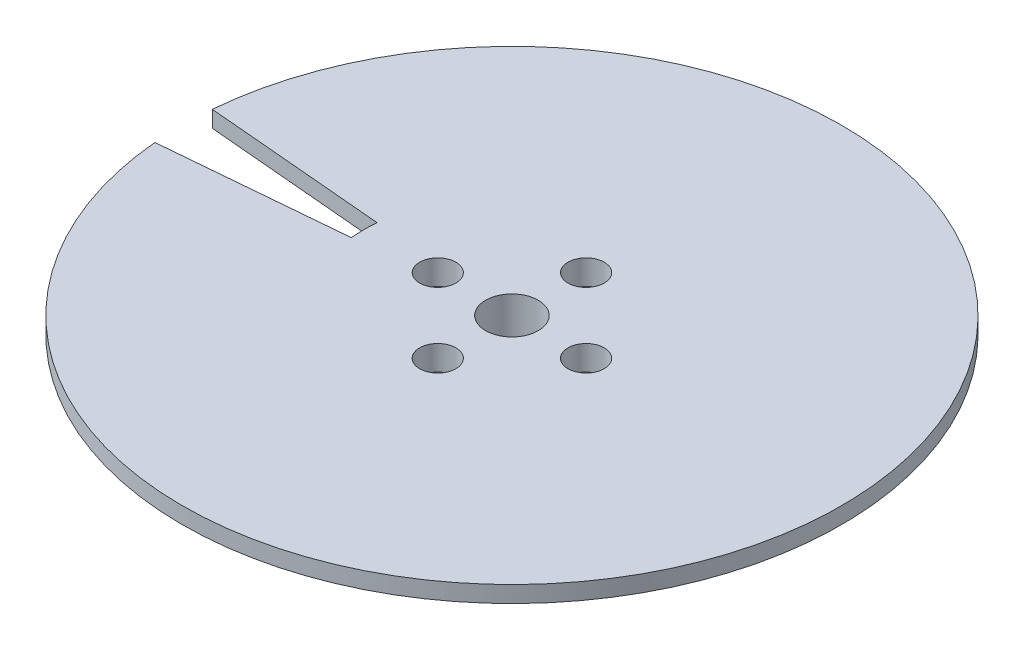
ISO-10303-21;
HEADER;
FILE_DESCRIPTION(('STEP AP214'),'2;1');
FILE_NAME('part.step','',(''),(''),'','','');
FILE_SCHEMA(('AUTOMOTIVE_DESIGN { 1 0 10303 214 1 1 1 1 }'));
ENDSEC;
DATA;
#1=APPLICATION_CONTEXT('core data for automotive mechanical design processes');
#2=APPLICATION_PROTOCOL_DEFINITION('international standard','automotive_design',2000,#1);
#3=PRODUCT_CONTEXT('',#1,'mechanical');
#4=PRODUCT('Part','Part','',(#3));
#5=PRODUCT_RELATED_PRODUCT_CATEGORY('part','',(#4));
#6=PRODUCT_DEFINITION_FORMATION('','',#4);
#7=PRODUCT_DEFINITION_CONTEXT('part definition',#1,'design');
#8=PRODUCT_DEFINITION('design','',#6,#7);
#9=PRODUCT_DEFINITION_SHAPE('','',#8);
#10=(LENGTH_UNIT() NAMED_UNIT(*) SI_UNIT(.MILLI.,.METRE.));
#11=(NAMED_UNIT(*) PLANE_ANGLE_UNIT() SI_UNIT($,.RADIAN.));
#12=(NAMED_UNIT(*) SI_UNIT($,.STERADIAN.) SOLID_ANGLE_UNIT());
#13=UNCERTAINTY_MEASURE_WITH_UNIT(LENGTH_MEASURE(1.E-05),#10,'distance_accuracy_value','');
#14=(GEOMETRIC_REPRESENTATION_CONTEXT(3) GLOBAL_UNCERTAINTY_ASSIGNED_CONTEXT((#13)) GLOBAL_UNIT_ASSIGNED_CONTEXT((#10,
#11,#12)) REPRESENTATION_CONTEXT('',''));
#15=CARTESIAN_POINT('',(0.,0.,0.));
#16=DIRECTION('',(0.,0.,1.));
#17=DIRECTION('',(1.,0.,0.));
#18=AXIS2_PLACEMENT_3D('',#15,#16,#17);
#19=CARTESIAN_POINT('',(0.,6.,0.));
#20=DIRECTION('',(0.,-1.,0.));
#21=DIRECTION('',(0.,0.,-1.));
#22=AXIS2_PLACEMENT_3D('',#19,#20,#21);
#23=CYLINDRICAL_SURFACE('',#22,7.5);
#24=DIRECTION('',(0.,-1.,0.));
#25=VECTOR('',#24,1.);
#26=CARTESIAN_POINT('',(0.85655319119696,3.,7.4509272329456));
#27=LINE('',#26,#25);
#28=CARTESIAN_POINT('',(0.856553191196959,3.,7.45092723294559));
#29=VERTEX_POINT('',#28);
#30=CARTESIAN_POINT('',(0.856553191196959,0.,7.45092723294559));
#31=VERTEX_POINT('',#30);
#32=EDGE_CURVE('E206',#29,#31,#27,.T.);
#33=ORIENTED_EDGE('',*,*,#32,.F.);
#34=CARTESIAN_POINT('',(0.,3.,0.));
#35=DIRECTION('',(0.,1.,0.));
#36=DIRECTION('',(0.,0.,1.));
#37=AXIS2_PLACEMENT_3D('',#34,#35,#36);
#38=CIRCLE('',#37,7.5);
#39=CARTESIAN_POINT('',(7.44042990767575,3.,0.943399591352612));
#40=VERTEX_POINT('',#39);
#41=EDGE_CURVE('E187',#29,#40,#38,.T.);
#42=ORIENTED_EDGE('',*,*,#41,.T.);
#43=DIRECTION('',(0.,-1.,0.));
#44=VECTOR('',#43,1.);
#45=CARTESIAN_POINT('',(7.44042990767575,3.,0.943399591352612));
#46=LINE('',#45,#44);
#47=CARTESIAN_POINT('',(7.44042990767575,0.,0.943399591352612));
#48=VERTEX_POINT('',#47);
#49=EDGE_CURVE('E401',#40,#48,#46,.T.);
#50=ORIENTED_EDGE('',*,*,#49,.T.);
#51=CARTESIAN_POINT('',(0.,0.,0.));
#52=DIRECTION('',(0.,1.,0.));
#53=DIRECTION('',(0.,0.,1.));
#54=AXIS2_PLACEMENT_3D('',#51,#52,#53);
#55=CIRCLE('',#54,7.5);
#56=EDGE_CURVE('E216',#31,#48,#55,.T.);
#57=ORIENTED_EDGE('',*,*,#56,.F.);
#58=EDGE_LOOP('',(#33,#42,#50,#57));
#59=FACE_BOUND('',#58,.T.);
#60=ADVANCED_FACE('F49',(#59),#23,.F.);
#61=DIRECTION('',(0.,-1.,0.));
#62=VECTOR('',#61,1.);
#63=CARTESIAN_POINT('',(7.45092723294559,3.,-0.856553191196986));
#64=LINE('',#63,#62);
#65=CARTESIAN_POINT('',(7.45092723294559,3.,-0.856553191196986));
#66=VERTEX_POINT('',#65);
#67=CARTESIAN_POINT('',(7.45092723294559,0.,-0.856553191196986));
#68=VERTEX_POINT('',#67);
#69=EDGE_CURVE('E396',#66,#68,#64,.T.);
#70=ORIENTED_EDGE('',*,*,#69,.F.);
#71=CARTESIAN_POINT('',(0.943399591352586,3.,-7.44042990767575));
#72=VERTEX_POINT('',#71);
#73=EDGE_CURVE('E200',#66,#72,#38,.T.);
#74=ORIENTED_EDGE('',*,*,#73,.T.);
#75=DIRECTION('',(0.,-1.,0.));
#76=VECTOR('',#75,1.);
#77=CARTESIAN_POINT('',(0.943399591352589,3.,-7.44042990767575));
#78=LINE('',#77,#76);
#79=CARTESIAN_POINT('',(0.943399591352589,0.,-7.44042990767575));
#80=VERTEX_POINT('',#79);
#81=EDGE_CURVE('E366',#72,#80,#78,.T.);
#82=ORIENTED_EDGE('',*,*,#81,.T.);
#83=EDGE_CURVE('E275',#68,#80,#55,.T.);
#84=ORIENTED_EDGE('',*,*,#83,.F.);
#85=EDGE_LOOP('',(#70,#74,#82,#84));
#86=FACE_BOUND('',#85,.T.);
#87=ADVANCED_FACE('F300',(#86),#23,.F.);
#88=DIRECTION('',(0.,-1.,0.));
#89=VECTOR('',#88,1.);
#90=CARTESIAN_POINT('',(-0.856553191197012,3.,-7.45092723294559));
#91=LINE('',#90,#89);
#92=CARTESIAN_POINT('',(-0.856553191197011,3.,-7.45092723294559));
#93=VERTEX_POINT('',#92);
#94=CARTESIAN_POINT('',(-0.856553191197012,0.,-7.45092723294559));
#95=VERTEX_POINT('',#94);
#96=EDGE_CURVE('E362',#93,#95,#91,.T.);
#97=ORIENTED_EDGE('',*,*,#96,.F.);
#98=CARTESIAN_POINT('',(-7.44042990767575,3.,-0.943399591352559));
#99=VERTEX_POINT('',#98);
#100=EDGE_CURVE('E453',#93,#99,#38,.T.);
#101=ORIENTED_EDGE('',*,*,#100,.T.);
#102=DIRECTION('',(0.,-1.,0.));
#103=VECTOR('',#102,1.);
#104=CARTESIAN_POINT('',(-7.44042990767576,3.,-0.943399591352555));
#105=LINE('',#104,#103);
#106=CARTESIAN_POINT('',(-7.44042990767576,0.,-0.943399591352555));
#107=VERTEX_POINT('',#106);
#108=EDGE_CURVE('E327',#99,#107,#105,.T.);
#109=ORIENTED_EDGE('',*,*,#108,.T.);
#110=EDGE_CURVE('E466',#95,#107,#55,.T.);
#111=ORIENTED_EDGE('',*,*,#110,.F.);
#112=EDGE_LOOP('',(#97,#101,#109,#111));
#113=FACE_BOUND('',#112,.T.);
#114=ADVANCED_FACE('F305',(#113),#23,.F.);
#115=DIRECTION('',(0.,-1.,0.));
#116=VECTOR('',#115,1.);
#117=CARTESIAN_POINT('',(-7.45092723294559,3.,0.856553191197039));
#118=LINE('',#117,#116);
#119=CARTESIAN_POINT('',(-7.45092723294559,3.,0.856553191197039));
#120=VERTEX_POINT('',#119);
#121=CARTESIAN_POINT('',(-7.45092723294559,0.,0.856553191197038));
#122=VERTEX_POINT('',#121);
#123=EDGE_CURVE('E321',#120,#122,#118,.T.);
#124=ORIENTED_EDGE('',*,*,#123,.F.);
#125=CARTESIAN_POINT('',(-0.943399591352638,3.,7.44042990767574));
#126=VERTEX_POINT('',#125);
#127=EDGE_CURVE('E202',#120,#126,#38,.T.);
#128=ORIENTED_EDGE('',*,*,#127,.T.);
#129=DIRECTION('',(0.,-1.,0.));
#130=VECTOR('',#129,1.);
#131=CARTESIAN_POINT('',(-0.943399591352635,3.,7.44042990767575));
#132=LINE('',#131,#130);
#133=CARTESIAN_POINT('',(-0.943399591352635,0.,7.44042990767575));
#134=VERTEX_POINT('',#133);
#135=EDGE_CURVE('E218',#126,#134,#132,.T.);
#136=ORIENTED_EDGE('',*,*,#135,.T.);
#137=EDGE_CURVE('E262',#122,#134,#55,.T.);
#138=ORIENTED_EDGE('',*,*,#137,.F.);
#139=EDGE_LOOP('',(#124,#128,#136,#138));
#140=FACE_BOUND('',#139,.T.);
#141=ADVANCED_FACE('F302',(#140),#23,.F.);
#142=CARTESIAN_POINT('',(0.,6.,0.));
#143=DIRECTION('',(0.,1.,0.));
#144=DIRECTION('',(0.,0.,1.));
#145=AXIS2_PLACEMENT_3D('',#142,#143,#144);
#146=PLANE('',#145);
#147=CARTESIAN_POINT('',(0.,6.,-4.5));
#148=DIRECTION('',(0.,1.,0.));
#149=DIRECTION('',(0.,0.,1.));
#150=AXIS2_PLACEMENT_3D('',#147,#148,#149);
#151=CIRCLE('',#150,1.1);
#152=CARTESIAN_POINT('',(0.,6.,-3.4));
#153=VERTEX_POINT('',#152);
#154=EDGE_CURVE('E505',#153,#153,#151,.T.);
#155=ORIENTED_EDGE('',*,*,#154,.F.);
#156=EDGE_LOOP('',(#155));
#157=FACE_BOUND('',#156,.T.);
#158=CARTESIAN_POINT('',(4.5,6.,0.));
#159=DIRECTION('',(0.,1.,0.));
#160=DIRECTION('',(0.,0.,1.));
#161=AXIS2_PLACEMENT_3D('',#158,#159,#160);
#162=CIRCLE('',#161,1.1);
#163=CARTESIAN_POINT('',(4.5,6.,1.1));
#164=VERTEX_POINT('',#163);
#165=EDGE_CURVE('E472',#164,#164,#162,.T.);
#166=ORIENTED_EDGE('',*,*,#165,.F.);
#167=EDGE_LOOP('',(#166));
#168=FACE_BOUND('',#167,.T.);
#169=CARTESIAN_POINT('',(0.,6.,4.5));
#170=DIRECTION('',(0.,1.,0.));
#171=DIRECTION('',(0.,0.,1.));
#172=AXIS2_PLACEMENT_3D('',#169,#170,#171);
#173=CIRCLE('',#172,1.1);
#174=CARTESIAN_POINT('',(0.,6.,5.6));
#175=VERTEX_POINT('',#174);
#176=EDGE_CURVE('E496',#175,#175,#173,.T.);
#177=ORIENTED_EDGE('',*,*,#176,.F.);
#178=EDGE_LOOP('',(#177));
#179=FACE_BOUND('',#178,.T.);
#180=CARTESIAN_POINT('',(-4.5,6.,0.));
#181=DIRECTION('',(0.,1.,0.));
#182=DIRECTION('',(0.,0.,1.));
#183=AXIS2_PLACEMENT_3D('',#180,#181,#182);
#184=CIRCLE('',#183,1.1);
#185=CARTESIAN_POINT('',(-4.5,6.,1.1));
#186=VERTEX_POINT('',#185);
#187=EDGE_CURVE('E474',#186,#186,#184,.T.);
#188=ORIENTED_EDGE('',*,*,#187,.F.);
#189=EDGE_LOOP('',(#188));
#190=FACE_BOUND('',#189,.T.);
#191=CARTESIAN_POINT('',(0.,6.,0.));
#192=DIRECTION('',(0.,1.,0.));
#193=DIRECTION('',(0.,0.,1.));
#194=AXIS2_PLACEMENT_3D('',#191,#192,#193);
#195=CIRCLE('',#194,1.6);
#196=CARTESIAN_POINT('',(0.,6.,1.6));
#197=VERTEX_POINT('',#196);
#198=EDGE_CURVE('E483',#197,#197,#195,.T.);
#199=ORIENTED_EDGE('',*,*,#198,.F.);
#200=EDGE_LOOP('',(#199));
#201=FACE_BOUND('',#200,.T.);
#202=CARTESIAN_POINT('',(0.,6.,0.));
#203=DIRECTION('',(0.,1.,0.));
#204=DIRECTION('',(0.,0.,1.));
#205=AXIS2_PLACEMENT_3D('',#202,#203,#204);
#206=CIRCLE('',#205,9.);
#207=CARTESIAN_POINT('',(-8.96575228282571,6.,-0.784401684728925));
#208=VERTEX_POINT('',#207);
#209=CARTESIAN_POINT('',(-8.96575228282571,6.,0.784401684728926));
#210=VERTEX_POINT('',#209);
#211=EDGE_CURVE('E274',#208,#210,#206,.T.);
#212=ORIENTED_EDGE('',*,*,#211,.T.);
#213=DIRECTION('',(-0.996194698091746,0.,0.0871557427476585));
#214=VECTOR('',#213,1.);
#215=CARTESIAN_POINT('',(0.,6.,0.));
#216=LINE('',#215,#214);
#217=CARTESIAN_POINT('',(-19.9238939618349,6.,1.74311485495317));
#218=VERTEX_POINT('',#217);
#219=EDGE_CURVE('E247',#210,#218,#216,.T.);
#220=ORIENTED_EDGE('',*,*,#219,.T.);
#221=CARTESIAN_POINT('',(0.,6.,0.));
#222=DIRECTION('',(0.,1.,0.));
#223=DIRECTION('',(0.,0.,1.));
#224=AXIS2_PLACEMENT_3D('',#221,#222,#223);
#225=CIRCLE('',#224,20.);
#226=CARTESIAN_POINT('',(-19.9238939618349,6.,-1.74311485495317));
#227=VERTEX_POINT('',#226);
#228=EDGE_CURVE('E251',#218,#227,#225,.T.);
#229=ORIENTED_EDGE('',*,*,#228,.T.);
#230=DIRECTION('',(-0.996194698091746,0.,-0.0871557427476583));
#231=VECTOR('',#230,1.);
#232=CARTESIAN_POINT('',(0.,6.,0.));
#233=LINE('',#232,#231);
#234=EDGE_CURVE('E236',#208,#227,#233,.T.);
#235=ORIENTED_EDGE('',*,*,#234,.F.);
#236=EDGE_LOOP('',(#212,#220,#229,#235));
#237=FACE_BOUND('',#236,.T.);
#238=ADVANCED_FACE('F310',(#157,#168,#179,#190,#201,#237),#146,.T.);
#239=CARTESIAN_POINT('',(0.,0.,0.));
#240=DIRECTION('',(0.,1.,0.));
#241=DIRECTION('',(0.,0.,1.));
#242=AXIS2_PLACEMENT_3D('',#239,#240,#241);
#243=PLANE('',#242);
#244=CARTESIAN_POINT('',(0.,0.,0.));
#245=DIRECTION('',(0.,1.,0.));
#246=DIRECTION('',(0.,0.,1.));
#247=AXIS2_PLACEMENT_3D('',#244,#245,#246);
#248=CIRCLE('',#247,7.99999999999999);
#249=CARTESIAN_POINT('',(0.,0.,7.99999999999999));
#250=VERTEX_POINT('',#249);
#251=EDGE_CURVE('E11',#250,#250,#248,.F.);
#252=ORIENTED_EDGE('',*,*,#251,.T.);
#253=EDGE_LOOP('',(#252));
#254=FACE_BOUND('',#253,.T.);
#255=ORIENTED_EDGE('',*,*,#56,.T.);
#256=DIRECTION('',(-1.,0.,0.));
#257=VECTOR('',#256,1.);
#258=CARTESIAN_POINT('',(6.3123397412791,0.,0.943399591352637));
#259=LINE('',#258,#257);
#260=CARTESIAN_POINT('',(5.41848661630125,0.,0.943399591352619));
#261=VERTEX_POINT('',#260);
#262=EDGE_CURVE('E413',#48,#261,#259,.T.);
#263=ORIENTED_EDGE('',*,*,#262,.T.);
#264=CARTESIAN_POINT('',(0.,0.,0.));
#265=DIRECTION('',(0.,1.,0.));
#266=DIRECTION('',(0.,0.,-1.));
#267=AXIS2_PLACEMENT_3D('',#264,#265,#266);
#268=CIRCLE('',#267,5.5);
#269=CARTESIAN_POINT('',(5.43289210555946,0.,-0.856553191196978));
#270=VERTEX_POINT('',#269);
#271=EDGE_CURVE('E410',#261,#270,#268,.T.);
#272=ORIENTED_EDGE('',*,*,#271,.T.);
#273=DIRECTION('',(1.,0.,0.));
#274=VECTOR('',#273,1.);
#275=CARTESIAN_POINT('',(6.32608265113426,0.,-0.856553191196982));
#276=LINE('',#275,#274);
#277=EDGE_CURVE('E418',#270,#68,#276,.T.);
#278=ORIENTED_EDGE('',*,*,#277,.T.);
#279=ORIENTED_EDGE('',*,*,#83,.T.);
#280=DIRECTION('',(0.,0.,1.));
#281=VECTOR('',#280,1.);
#282=CARTESIAN_POINT('',(0.943399591352638,0.,-6.3123397412791));
#283=LINE('',#282,#281);
#284=CARTESIAN_POINT('',(0.9433995913526,0.,-5.41848661630125));
#285=VERTEX_POINT('',#284);
#286=EDGE_CURVE('E379',#80,#285,#283,.T.);
#287=ORIENTED_EDGE('',*,*,#286,.T.);
#288=CARTESIAN_POINT('',(0.,0.,0.));
#289=DIRECTION('',(0.,1.,0.));
#290=DIRECTION('',(0.,0.,-1.));
#291=AXIS2_PLACEMENT_3D('',#288,#289,#290);
#292=CIRCLE('',#291,5.5);
#293=CARTESIAN_POINT('',(-0.856553191196997,0.,-5.43289210555945));
#294=VERTEX_POINT('',#293);
#295=EDGE_CURVE('E376',#285,#294,#292,.T.);
#296=ORIENTED_EDGE('',*,*,#295,.T.);
#297=DIRECTION('',(0.,0.,-1.));
#298=VECTOR('',#297,1.);
#299=CARTESIAN_POINT('',(-0.856553191197004,0.,-6.32608265113425));
#300=LINE('',#299,#298);
#301=EDGE_CURVE('E73',#294,#95,#300,.T.);
#302=ORIENTED_EDGE('',*,*,#301,.T.);
#303=ORIENTED_EDGE('',*,*,#110,.T.);
#304=DIRECTION('',(1.,0.,0.));
#305=VECTOR('',#304,1.);
#306=CARTESIAN_POINT('',(-6.3123397412791,0.,-0.943399591352638));
#307=LINE('',#306,#305);
#308=CARTESIAN_POINT('',(-5.41848661630125,0.,-0.943399591352581));
#309=VERTEX_POINT('',#308);
#310=EDGE_CURVE('E349',#107,#309,#307,.T.);
#311=ORIENTED_EDGE('',*,*,#310,.T.);
#312=CARTESIAN_POINT('',(0.,0.,0.));
#313=DIRECTION('',(0.,1.,0.));
#314=DIRECTION('',(0.,0.,-1.));
#315=AXIS2_PLACEMENT_3D('',#312,#313,#314);
#316=CIRCLE('',#315,5.5);
#317=CARTESIAN_POINT('',(-5.43289210555945,0.,0.856553191197016));
#318=VERTEX_POINT('',#317);
#319=EDGE_CURVE('E346',#309,#318,#316,.T.);
#320=ORIENTED_EDGE('',*,*,#319,.T.);
#321=DIRECTION('',(-1.,0.,0.));
#322=VECTOR('',#321,1.);
#323=CARTESIAN_POINT('',(-6.32608265113425,0.,0.856553191197027));
#324=LINE('',#323,#322);
#325=EDGE_CURVE('E66',#318,#122,#324,.T.);
#326=ORIENTED_EDGE('',*,*,#325,.T.);
#327=ORIENTED_EDGE('',*,*,#137,.T.);
#328=DIRECTION('',(0.,0.,-1.));
#329=VECTOR('',#328,1.);
#330=CARTESIAN_POINT('',(-0.943399591352637,0.,6.3123397412791));
#331=LINE('',#330,#329);
#332=CARTESIAN_POINT('',(-0.943399591352638,0.,5.41848661630124));
#333=VERTEX_POINT('',#332);
#334=EDGE_CURVE('E435',#134,#333,#331,.T.);
#335=ORIENTED_EDGE('',*,*,#334,.T.);
#336=CARTESIAN_POINT('',(0.,0.,0.));
#337=DIRECTION('',(0.,1.,0.));
#338=DIRECTION('',(0.,0.,-1.));
#339=AXIS2_PLACEMENT_3D('',#336,#337,#338);
#340=CIRCLE('',#339,5.5);
#341=CARTESIAN_POINT('',(0.85655319119696,0.,5.43289210555946));
#342=VERTEX_POINT('',#341);
#343=EDGE_CURVE('E213',#333,#342,#340,.T.);
#344=ORIENTED_EDGE('',*,*,#343,.T.);
#345=DIRECTION('',(0.,0.,1.));
#346=VECTOR('',#345,1.);
#347=CARTESIAN_POINT('',(0.85655319119696,0.,6.32608265113426));
#348=LINE('',#347,#346);
#349=EDGE_CURVE('E421',#342,#31,#348,.T.);
#350=ORIENTED_EDGE('',*,*,#349,.T.);
#351=EDGE_LOOP('',(#255,#263,#272,#278,#279,#287,#296,#302,#303,#311,#320,#326,#327,#335,#344,#350));
#352=FACE_BOUND('',#351,.T.);
#353=ADVANCED_FACE('F315',(#254,#352),#243,.F.);
#354=CARTESIAN_POINT('',(0.,6.,0.));
#355=DIRECTION('',(0.,-1.,0.));
#356=DIRECTION('',(0.,0.,-1.));
#357=AXIS2_PLACEMENT_3D('',#354,#355,#356);
#358=CYLINDRICAL_SURFACE('',#357,9.);
#359=CARTESIAN_POINT('',(0.,1.,0.));
#360=DIRECTION('',(0.,1.,0.));
#361=DIRECTION('',(0.,0.,1.));
#362=AXIS2_PLACEMENT_3D('',#359,#360,#361);
#363=CIRCLE('',#362,9.);
#364=CARTESIAN_POINT('',(0.,1.,9.));
#365=VERTEX_POINT('',#364);
#366=EDGE_CURVE('E59',#365,#365,#363,.T.);
#367=ORIENTED_EDGE('',*,*,#366,.T.);
#368=EDGE_LOOP('',(#367));
#369=FACE_BOUND('',#368,.T.);
#370=CARTESIAN_POINT('',(0.,5.,0.));
#371=DIRECTION('',(0.,1.,0.));
#372=DIRECTION('',(0.,0.,1.));
#373=AXIS2_PLACEMENT_3D('',#370,#371,#372);
#374=CIRCLE('',#373,9.);
#375=CARTESIAN_POINT('',(-8.96575228282571,5.,0.784401684728926));
#376=VERTEX_POINT('',#375);
#377=CARTESIAN_POINT('',(-8.96575228282571,5.,-0.784401684728925));
#378=VERTEX_POINT('',#377);
#379=EDGE_CURVE('E243',#376,#378,#374,.T.);
#380=ORIENTED_EDGE('',*,*,#379,.F.);
#381=DIRECTION('',(0.,1.,0.));
#382=VECTOR('',#381,1.);
#383=CARTESIAN_POINT('',(-8.96575228282571,5.,0.784401684728926));
#384=LINE('',#383,#382);
#385=EDGE_CURVE('E258',#376,#210,#384,.T.);
#386=ORIENTED_EDGE('',*,*,#385,.T.);
#387=ORIENTED_EDGE('',*,*,#211,.F.);
#388=DIRECTION('',(0.,1.,0.));
#389=VECTOR('',#388,1.);
#390=CARTESIAN_POINT('',(-8.96575228282571,5.,-0.784401684728925));
#391=LINE('',#390,#389);
#392=EDGE_CURVE('E263',#378,#208,#391,.T.);
#393=ORIENTED_EDGE('',*,*,#392,.F.);
#394=EDGE_LOOP('',(#380,#386,#387,#393));
#395=FACE_BOUND('',#394,.T.);
#396=ADVANCED_FACE('F283',(#369,#395),#358,.T.);
#397=CARTESIAN_POINT('',(0.,5.,0.));
#398=DIRECTION('',(-0.0871557427476585,0.,-0.996194698091746));
#399=DIRECTION('',(-0.996194698091746,0.,0.0871557427476585));
#400=AXIS2_PLACEMENT_3D('',#397,#398,#399);
#401=PLANE('',#400);
#402=ORIENTED_EDGE('',*,*,#219,.F.);
#403=ORIENTED_EDGE('',*,*,#385,.F.);
#404=DIRECTION('',(-0.996194698091746,0.,0.0871557427476585));
#405=VECTOR('',#404,1.);
#406=CARTESIAN_POINT('',(0.,5.,0.));
#407=LINE('',#406,#405);
#408=CARTESIAN_POINT('',(-19.9238939618349,5.,1.74311485495317));
#409=VERTEX_POINT('',#408);
#410=EDGE_CURVE('E231',#376,#409,#407,.T.);
#411=ORIENTED_EDGE('',*,*,#410,.T.);
#412=DIRECTION('',(0.,1.,0.));
#413=VECTOR('',#412,1.);
#414=CARTESIAN_POINT('',(-19.9238939618349,5.,1.74311485495317));
#415=LINE('',#414,#413);
#416=EDGE_CURVE('E246',#409,#218,#415,.T.);
#417=ORIENTED_EDGE('',*,*,#416,.T.);
#418=EDGE_LOOP('',(#402,#403,#411,#417));
#419=FACE_BOUND('',#418,.T.);
#420=ADVANCED_FACE('F534',(#419),#401,.T.);
#421=CARTESIAN_POINT('',(0.,5.,0.));
#422=DIRECTION('',(0.0871557427476583,0.,-0.996194698091746));
#423=DIRECTION('',(-0.996194698091746,0.,-0.0871557427476583));
#424=AXIS2_PLACEMENT_3D('',#421,#422,#423);
#425=PLANE('',#424);
#426=ORIENTED_EDGE('',*,*,#234,.T.);
#427=DIRECTION('',(0.,1.,0.));
#428=VECTOR('',#427,1.);
#429=CARTESIAN_POINT('',(-19.9238939618349,5.,-1.74311485495317));
#430=LINE('',#429,#428);
#431=CARTESIAN_POINT('',(-19.9238939618349,5.,-1.74311485495317));
#432=VERTEX_POINT('',#431);
#433=EDGE_CURVE('E267',#432,#227,#430,.T.);
#434=ORIENTED_EDGE('',*,*,#433,.F.);
#435=DIRECTION('',(-0.996194698091746,0.,-0.0871557427476583));
#436=VECTOR('',#435,1.);
#437=CARTESIAN_POINT('',(0.,5.,0.));
#438=LINE('',#437,#436);
#439=EDGE_CURVE('E240',#378,#432,#438,.T.);
#440=ORIENTED_EDGE('',*,*,#439,.F.);
#441=ORIENTED_EDGE('',*,*,#392,.T.);
#442=EDGE_LOOP('',(#426,#434,#440,#441));
#443=FACE_BOUND('',#442,.T.);
#444=ADVANCED_FACE('F544',(#443),#425,.F.);
#445=CARTESIAN_POINT('',(0.,5.,0.));
#446=DIRECTION('',(0.,1.,0.));
#447=DIRECTION('',(0.,0.,1.));
#448=AXIS2_PLACEMENT_3D('',#445,#446,#447);
#449=CYLINDRICAL_SURFACE('',#448,20.);
#450=ORIENTED_EDGE('',*,*,#228,.F.);
#451=ORIENTED_EDGE('',*,*,#416,.F.);
#452=CARTESIAN_POINT('',(0.,5.,0.));
#453=DIRECTION('',(0.,1.,0.));
#454=DIRECTION('',(0.,0.,1.));
#455=AXIS2_PLACEMENT_3D('',#452,#453,#454);
#456=CIRCLE('',#455,20.);
#457=EDGE_CURVE('E235',#409,#432,#456,.T.);
#458=ORIENTED_EDGE('',*,*,#457,.T.);
#459=ORIENTED_EDGE('',*,*,#433,.T.);
#460=EDGE_LOOP('',(#450,#451,#458,#459));
#461=FACE_BOUND('',#460,.T.);
#462=ADVANCED_FACE('F542',(#461),#449,.T.);
#463=CARTESIAN_POINT('',(0.,5.,0.));
#464=DIRECTION('',(0.,1.,0.));
#465=DIRECTION('',(0.,0.,1.));
#466=AXIS2_PLACEMENT_3D('',#463,#464,#465);
#467=PLANE('',#466);
#468=ORIENTED_EDGE('',*,*,#410,.F.);
#469=ORIENTED_EDGE('',*,*,#379,.T.);
#470=ORIENTED_EDGE('',*,*,#439,.T.);
#471=ORIENTED_EDGE('',*,*,#457,.F.);
#472=EDGE_LOOP('',(#468,#469,#470,#471));
#473=FACE_BOUND('',#472,.T.);
#474=ADVANCED_FACE('F537',(#473),#467,.F.);
#475=CARTESIAN_POINT('',(0.,3.,0.));
#476=DIRECTION('',(0.,-1.,0.));
#477=DIRECTION('',(0.,0.,-1.));
#478=AXIS2_PLACEMENT_3D('',#475,#476,#477);
#479=CYLINDRICAL_SURFACE('',#478,5.5);
#480=ORIENTED_EDGE('',*,*,#343,.F.);
#481=DIRECTION('',(0.,-1.,0.));
#482=VECTOR('',#481,1.);
#483=CARTESIAN_POINT('',(-0.943399591352638,3.,5.41848661630124));
#484=LINE('',#483,#482);
#485=CARTESIAN_POINT('',(-0.943399591352638,3.,5.41848661630124));
#486=VERTEX_POINT('',#485);
#487=EDGE_CURVE('E225',#486,#333,#484,.T.);
#488=ORIENTED_EDGE('',*,*,#487,.F.);
#489=CARTESIAN_POINT('',(0.,3.,0.));
#490=DIRECTION('',(0.,1.,0.));
#491=DIRECTION('',(0.,0.,-1.));
#492=AXIS2_PLACEMENT_3D('',#489,#490,#491);
#493=CIRCLE('',#492,5.5);
#494=CARTESIAN_POINT('',(0.85655319119696,3.,5.43289210555946));
#495=VERTEX_POINT('',#494);
#496=EDGE_CURVE('E219',#486,#495,#493,.T.);
#497=ORIENTED_EDGE('',*,*,#496,.T.);
#498=DIRECTION('',(0.,-1.,0.));
#499=VECTOR('',#498,1.);
#500=CARTESIAN_POINT('',(0.85655319119696,3.,5.43289210555946));
#501=LINE('',#500,#499);
#502=EDGE_CURVE('E209',#495,#342,#501,.T.);
#503=ORIENTED_EDGE('',*,*,#502,.T.);
#504=EDGE_LOOP('',(#480,#488,#497,#503));
#505=FACE_BOUND('',#504,.T.);
#506=ADVANCED_FACE('F450',(#505),#479,.F.);
#507=CARTESIAN_POINT('',(-0.943399591352637,3.,6.3123397412791));
#508=DIRECTION('',(-1.,0.,0.));
#509=DIRECTION('',(0.,0.,1.));
#510=AXIS2_PLACEMENT_3D('',#507,#508,#509);
#511=PLANE('',#510);
#512=ORIENTED_EDGE('',*,*,#334,.F.);
#513=ORIENTED_EDGE('',*,*,#135,.F.);
#514=DIRECTION('',(0.,0.,-1.));
#515=VECTOR('',#514,1.);
#516=CARTESIAN_POINT('',(-0.943399591352637,3.,6.3123397412791));
#517=LINE('',#516,#515);
#518=EDGE_CURVE('E212',#126,#486,#517,.T.);
#519=ORIENTED_EDGE('',*,*,#518,.T.);
#520=ORIENTED_EDGE('',*,*,#487,.T.);
#521=EDGE_LOOP('',(#512,#513,#519,#520));
#522=FACE_BOUND('',#521,.T.);
#523=ADVANCED_FACE('F447',(#522),#511,.T.);
#524=CARTESIAN_POINT('',(0.85655319119696,3.,6.32608265113426));
#525=DIRECTION('',(1.,0.,0.));
#526=DIRECTION('',(0.,0.,-1.));
#527=AXIS2_PLACEMENT_3D('',#524,#525,#526);
#528=PLANE('',#527);
#529=ORIENTED_EDGE('',*,*,#349,.F.);
#530=ORIENTED_EDGE('',*,*,#502,.F.);
#531=DIRECTION('',(0.,0.,1.));
#532=VECTOR('',#531,1.);
#533=CARTESIAN_POINT('',(0.85655319119696,3.,6.32608265113426));
#534=LINE('',#533,#532);
#535=EDGE_CURVE('E190',#495,#29,#534,.T.);
#536=ORIENTED_EDGE('',*,*,#535,.T.);
#537=ORIENTED_EDGE('',*,*,#32,.T.);
#538=EDGE_LOOP('',(#529,#530,#536,#537));
#539=FACE_BOUND('',#538,.T.);
#540=ADVANCED_FACE('F205',(#539),#528,.T.);
#541=CARTESIAN_POINT('',(0.,3.,0.));
#542=DIRECTION('',(0.,-1.,0.));
#543=DIRECTION('',(0.,0.,-1.));
#544=AXIS2_PLACEMENT_3D('',#541,#542,#543);
#545=CYLINDRICAL_SURFACE('',#544,5.5);
#546=ORIENTED_EDGE('',*,*,#271,.F.);
#547=DIRECTION('',(0.,-1.,0.));
#548=VECTOR('',#547,1.);
#549=CARTESIAN_POINT('',(5.41848661630125,3.,0.943399591352619));
#550=LINE('',#549,#548);
#551=CARTESIAN_POINT('',(5.41848661630125,3.,0.943399591352619));
#552=VERTEX_POINT('',#551);
#553=EDGE_CURVE('E404',#552,#261,#550,.T.);
#554=ORIENTED_EDGE('',*,*,#553,.F.);
#555=CARTESIAN_POINT('',(0.,3.,0.));
#556=DIRECTION('',(0.,1.,0.));
#557=DIRECTION('',(0.,0.,-1.));
#558=AXIS2_PLACEMENT_3D('',#555,#556,#557);
#559=CIRCLE('',#558,5.5);
#560=CARTESIAN_POINT('',(5.43289210555946,3.,-0.856553191196979));
#561=VERTEX_POINT('',#560);
#562=EDGE_CURVE('E400',#552,#561,#559,.T.);
#563=ORIENTED_EDGE('',*,*,#562,.T.);
#564=DIRECTION('',(0.,-1.,0.));
#565=VECTOR('',#564,1.);
#566=CARTESIAN_POINT('',(5.43289210555946,3.,-0.856553191196978));
#567=LINE('',#566,#565);
#568=EDGE_CURVE('E386',#561,#270,#567,.T.);
#569=ORIENTED_EDGE('',*,*,#568,.T.);
#570=EDGE_LOOP('',(#546,#554,#563,#569));
#571=FACE_BOUND('',#570,.T.);
#572=ADVANCED_FACE('F556',(#571),#545,.F.);
#573=CARTESIAN_POINT('',(6.3123397412791,3.,0.943399591352637));
#574=DIRECTION('',(0.,0.,1.));
#575=DIRECTION('',(1.,0.,0.));
#576=AXIS2_PLACEMENT_3D('',#573,#574,#575);
#577=PLANE('',#576);
#578=ORIENTED_EDGE('',*,*,#262,.F.);
#579=ORIENTED_EDGE('',*,*,#49,.F.);
#580=DIRECTION('',(-1.,0.,0.));
#581=VECTOR('',#580,1.);
#582=CARTESIAN_POINT('',(6.3123397412791,3.,0.943399591352637));
#583=LINE('',#582,#581);
#584=EDGE_CURVE('E193',#40,#552,#583,.T.);
#585=ORIENTED_EDGE('',*,*,#584,.T.);
#586=ORIENTED_EDGE('',*,*,#553,.T.);
#587=EDGE_LOOP('',(#578,#579,#585,#586));
#588=FACE_BOUND('',#587,.T.);
#589=ADVANCED_FACE('F563',(#588),#577,.T.);
#590=CARTESIAN_POINT('',(6.32608265113426,3.,-0.856553191196982));
#591=DIRECTION('',(0.,0.,-1.));
#592=DIRECTION('',(-1.,0.,0.));
#593=AXIS2_PLACEMENT_3D('',#590,#591,#592);
#594=PLANE('',#593);
#595=ORIENTED_EDGE('',*,*,#277,.F.);
#596=ORIENTED_EDGE('',*,*,#568,.F.);
#597=DIRECTION('',(1.,0.,0.));
#598=VECTOR('',#597,1.);
#599=CARTESIAN_POINT('',(6.32608265113426,3.,-0.856553191196982));
#600=LINE('',#599,#598);
#601=EDGE_CURVE('E414',#561,#66,#600,.T.);
#602=ORIENTED_EDGE('',*,*,#601,.T.);
#603=ORIENTED_EDGE('',*,*,#69,.T.);
#604=EDGE_LOOP('',(#595,#596,#602,#603));
#605=FACE_BOUND('',#604,.T.);
#606=ADVANCED_FACE('F567',(#605),#594,.T.);
#607=CARTESIAN_POINT('',(0.,3.,0.));
#608=DIRECTION('',(0.,-1.,0.));
#609=DIRECTION('',(0.,0.,-1.));
#610=AXIS2_PLACEMENT_3D('',#607,#608,#609);
#611=CYLINDRICAL_SURFACE('',#610,5.5);
#612=ORIENTED_EDGE('',*,*,#295,.F.);
#613=DIRECTION('',(0.,-1.,0.));
#614=VECTOR('',#613,1.);
#615=CARTESIAN_POINT('',(0.9433995913526,3.,-5.41848661630125));
#616=LINE('',#615,#614);
#617=CARTESIAN_POINT('',(0.9433995913526,3.,-5.41848661630125));
#618=VERTEX_POINT('',#617);
#619=EDGE_CURVE('E370',#618,#285,#616,.T.);
#620=ORIENTED_EDGE('',*,*,#619,.F.);
#621=CARTESIAN_POINT('',(0.,3.,0.));
#622=DIRECTION('',(0.,1.,0.));
#623=DIRECTION('',(0.,0.,-1.));
#624=AXIS2_PLACEMENT_3D('',#621,#622,#623);
#625=CIRCLE('',#624,5.5);
#626=CARTESIAN_POINT('',(-0.856553191196997,3.,-5.43289210555945));
#627=VERTEX_POINT('',#626);
#628=EDGE_CURVE('E365',#618,#627,#625,.T.);
#629=ORIENTED_EDGE('',*,*,#628,.T.);
#630=DIRECTION('',(0.,-1.,0.));
#631=VECTOR('',#630,1.);
#632=CARTESIAN_POINT('',(-0.856553191196997,3.,-5.43289210555945));
#633=LINE('',#632,#631);
#634=EDGE_CURVE('E355',#627,#294,#633,.T.);
#635=ORIENTED_EDGE('',*,*,#634,.T.);
#636=EDGE_LOOP('',(#612,#620,#629,#635));
#637=FACE_BOUND('',#636,.T.);
#638=ADVANCED_FACE('F571',(#637),#611,.F.);
#639=CARTESIAN_POINT('',(0.943399591352638,3.,-6.3123397412791));
#640=DIRECTION('',(1.,0.,0.));
#641=DIRECTION('',(0.,0.,-1.));
#642=AXIS2_PLACEMENT_3D('',#639,#640,#641);
#643=PLANE('',#642);
#644=ORIENTED_EDGE('',*,*,#286,.F.);
#645=ORIENTED_EDGE('',*,*,#81,.F.);
#646=DIRECTION('',(0.,0.,1.));
#647=VECTOR('',#646,1.);
#648=CARTESIAN_POINT('',(0.943399591352638,3.,-6.3123397412791));
#649=LINE('',#648,#647);
#650=EDGE_CURVE('E389',#72,#618,#649,.T.);
#651=ORIENTED_EDGE('',*,*,#650,.T.);
#652=ORIENTED_EDGE('',*,*,#619,.T.);
#653=EDGE_LOOP('',(#644,#645,#651,#652));
#654=FACE_BOUND('',#653,.T.);
#655=ADVANCED_FACE('F575',(#654),#643,.T.);
#656=CARTESIAN_POINT('',(-0.856553191197004,3.,-6.32608265113425));
#657=DIRECTION('',(-1.,0.,0.));
#658=DIRECTION('',(0.,0.,1.));
#659=AXIS2_PLACEMENT_3D('',#656,#657,#658);
#660=PLANE('',#659);
#661=ORIENTED_EDGE('',*,*,#301,.F.);
#662=ORIENTED_EDGE('',*,*,#634,.F.);
#663=DIRECTION('',(0.,0.,-1.));
#664=VECTOR('',#663,1.);
#665=CARTESIAN_POINT('',(-0.856553191197004,3.,-6.32608265113425));
#666=LINE('',#665,#664);
#667=EDGE_CURVE('E380',#627,#93,#666,.T.);
#668=ORIENTED_EDGE('',*,*,#667,.T.);
#669=ORIENTED_EDGE('',*,*,#96,.T.);
#670=EDGE_LOOP('',(#661,#662,#668,#669));
#671=FACE_BOUND('',#670,.T.);
#672=ADVANCED_FACE('F579',(#671),#660,.T.);
#673=CARTESIAN_POINT('',(0.,3.,0.));
#674=DIRECTION('',(0.,-1.,0.));
#675=DIRECTION('',(0.,0.,-1.));
#676=AXIS2_PLACEMENT_3D('',#673,#674,#675);
#677=CYLINDRICAL_SURFACE('',#676,5.5);
#678=ORIENTED_EDGE('',*,*,#319,.F.);
#679=DIRECTION('',(0.,-1.,0.));
#680=VECTOR('',#679,1.);
#681=CARTESIAN_POINT('',(-5.41848661630125,3.,-0.943399591352581));
#682=LINE('',#681,#680);
#683=CARTESIAN_POINT('',(-5.41848661630125,3.,-0.943399591352581));
#684=VERTEX_POINT('',#683);
#685=EDGE_CURVE('E337',#684,#309,#682,.T.);
#686=ORIENTED_EDGE('',*,*,#685,.F.);
#687=CARTESIAN_POINT('',(0.,3.,0.));
#688=DIRECTION('',(0.,1.,0.));
#689=DIRECTION('',(0.,0.,-1.));
#690=AXIS2_PLACEMENT_3D('',#687,#688,#689);
#691=CIRCLE('',#690,5.5);
#692=CARTESIAN_POINT('',(-5.43289210555945,3.,0.856553191197017));
#693=VERTEX_POINT('',#692);
#694=EDGE_CURVE('E326',#684,#693,#691,.T.);
#695=ORIENTED_EDGE('',*,*,#694,.T.);
#696=DIRECTION('',(0.,-1.,0.));
#697=VECTOR('',#696,1.);
#698=CARTESIAN_POINT('',(-5.43289210555945,3.,0.856553191197016));
#699=LINE('',#698,#697);
#700=EDGE_CURVE('E199',#693,#318,#699,.T.);
#701=ORIENTED_EDGE('',*,*,#700,.T.);
#702=EDGE_LOOP('',(#678,#686,#695,#701));
#703=FACE_BOUND('',#702,.T.);
#704=ADVANCED_FACE('F459',(#703),#677,.F.);
#705=CARTESIAN_POINT('',(-6.3123397412791,3.,-0.943399591352638));
#706=DIRECTION('',(0.,0.,-1.));
#707=DIRECTION('',(-1.,0.,0.));
#708=AXIS2_PLACEMENT_3D('',#705,#706,#707);
#709=PLANE('',#708);
#710=ORIENTED_EDGE('',*,*,#310,.F.);
#711=ORIENTED_EDGE('',*,*,#108,.F.);
#712=DIRECTION('',(1.,0.,0.));
#713=VECTOR('',#712,1.);
#714=CARTESIAN_POINT('',(-6.3123397412791,3.,-0.943399591352638));
#715=LINE('',#714,#713);
#716=EDGE_CURVE('E333',#99,#684,#715,.T.);
#717=ORIENTED_EDGE('',*,*,#716,.T.);
#718=ORIENTED_EDGE('',*,*,#685,.T.);
#719=EDGE_LOOP('',(#710,#711,#717,#718));
#720=FACE_BOUND('',#719,.T.);
#721=ADVANCED_FACE('F463',(#720),#709,.T.);
#722=CARTESIAN_POINT('',(-6.32608265113425,3.,0.856553191197027));
#723=DIRECTION('',(0.,0.,1.));
#724=DIRECTION('',(1.,0.,0.));
#725=AXIS2_PLACEMENT_3D('',#722,#723,#724);
#726=PLANE('',#725);
#727=ORIENTED_EDGE('',*,*,#325,.F.);
#728=ORIENTED_EDGE('',*,*,#700,.F.);
#729=DIRECTION('',(-1.,0.,0.));
#730=VECTOR('',#729,1.);
#731=CARTESIAN_POINT('',(-6.32608265113425,3.,0.856553191197027));
#732=LINE('',#731,#730);
#733=EDGE_CURVE('E350',#693,#120,#732,.T.);
#734=ORIENTED_EDGE('',*,*,#733,.T.);
#735=ORIENTED_EDGE('',*,*,#123,.T.);
#736=EDGE_LOOP('',(#727,#728,#734,#735));
#737=FACE_BOUND('',#736,.T.);
#738=ADVANCED_FACE('F455',(#737),#726,.T.);
#739=CARTESIAN_POINT('',(0.,3.,0.));
#740=DIRECTION('',(0.,1.,0.));
#741=DIRECTION('',(0.,0.,1.));
#742=AXIS2_PLACEMENT_3D('',#739,#740,#741);
#743=PLANE('',#742);
#744=CARTESIAN_POINT('',(0.,3.,0.));
#745=DIRECTION('',(0.,1.,0.));
#746=DIRECTION('',(0.,0.,1.));
#747=AXIS2_PLACEMENT_3D('',#744,#745,#746);
#748=CIRCLE('',#747,1.6);
#749=CARTESIAN_POINT('',(0.,3.,1.6));
#750=VERTEX_POINT('',#749);
#751=EDGE_CURVE('E454',#750,#750,#748,.T.);
#752=ORIENTED_EDGE('',*,*,#751,.T.);
#753=EDGE_LOOP('',(#752));
#754=FACE_BOUND('',#753,.T.);
#755=ORIENTED_EDGE('',*,*,#518,.F.);
#756=ORIENTED_EDGE('',*,*,#127,.F.);
#757=ORIENTED_EDGE('',*,*,#733,.F.);
#758=ORIENTED_EDGE('',*,*,#694,.F.);
#759=ORIENTED_EDGE('',*,*,#716,.F.);
#760=ORIENTED_EDGE('',*,*,#100,.F.);
#761=ORIENTED_EDGE('',*,*,#667,.F.);
#762=ORIENTED_EDGE('',*,*,#628,.F.);
#763=ORIENTED_EDGE('',*,*,#650,.F.);
#764=ORIENTED_EDGE('',*,*,#73,.F.);
#765=ORIENTED_EDGE('',*,*,#601,.F.);
#766=ORIENTED_EDGE('',*,*,#562,.F.);
#767=ORIENTED_EDGE('',*,*,#584,.F.);
#768=ORIENTED_EDGE('',*,*,#41,.F.);
#769=ORIENTED_EDGE('',*,*,#535,.F.);
#770=ORIENTED_EDGE('',*,*,#496,.F.);
#771=EDGE_LOOP('',(#755,#756,#757,#758,#759,#760,#761,#762,#763,#764,#765,#766,#767,#768,#769,#770));
#772=FACE_BOUND('',#771,.T.);
#773=ADVANCED_FACE('F189',(#754,#772),#743,.F.);
#774=CARTESIAN_POINT('',(0.,3.,0.));
#775=DIRECTION('',(0.,1.,0.));
#776=DIRECTION('',(0.,0.,1.));
#777=AXIS2_PLACEMENT_3D('',#774,#775,#776);
#778=CYLINDRICAL_SURFACE('',#777,1.6);
#779=ORIENTED_EDGE('',*,*,#751,.F.);
#780=EDGE_LOOP('',(#779));
#781=FACE_BOUND('',#780,.T.);
#782=ORIENTED_EDGE('',*,*,#198,.T.);
#783=EDGE_LOOP('',(#782));
#784=FACE_BOUND('',#783,.T.);
#785=ADVANCED_FACE('F288',(#781,#784),#778,.F.);
#786=CARTESIAN_POINT('',(0.,1.,0.));
#787=DIRECTION('',(0.,1.,0.));
#788=DIRECTION('',(0.,0.,1.));
#789=AXIS2_PLACEMENT_3D('',#786,#787,#788);
#790=CONICAL_SURFACE('',#789,9.,0.78539816339745);
#791=ORIENTED_EDGE('',*,*,#251,.F.);
#792=EDGE_LOOP('',(#791));
#793=FACE_BOUND('',#792,.T.);
#794=ORIENTED_EDGE('',*,*,#366,.F.);
#795=EDGE_LOOP('',(#794));
#796=FACE_BOUND('',#795,.T.);
#797=ADVANCED_FACE('F52',(#793,#796),#790,.T.);
#798=CARTESIAN_POINT('',(-4.5,4.5,0.));
#799=DIRECTION('',(0.,1.,0.));
#800=DIRECTION('',(0.,0.,1.));
#801=AXIS2_PLACEMENT_3D('',#798,#799,#800);
#802=CYLINDRICAL_SURFACE('',#801,1.1);
#803=CARTESIAN_POINT('',(-4.5,4.5,0.));
#804=DIRECTION('',(0.,1.,0.));
#805=DIRECTION('',(0.,0.,1.));
#806=AXIS2_PLACEMENT_3D('',#803,#804,#805);
#807=CIRCLE('',#806,1.1);
#808=CARTESIAN_POINT('',(-4.5,4.5,1.1));
#809=VERTEX_POINT('',#808);
#810=EDGE_CURVE('E477',#809,#809,#807,.T.);
#811=ORIENTED_EDGE('',*,*,#810,.F.);
#812=EDGE_LOOP('',(#811));
#813=FACE_BOUND('',#812,.T.);
#814=ORIENTED_EDGE('',*,*,#187,.T.);
#815=EDGE_LOOP('',(#814));
#816=FACE_BOUND('',#815,.T.);
#817=ADVANCED_FACE('F287',(#813,#816),#802,.F.);
#818=CARTESIAN_POINT('',(-4.5,4.5,0.));
#819=DIRECTION('',(0.,1.,0.));
#820=DIRECTION('',(0.,0.,1.));
#821=AXIS2_PLACEMENT_3D('',#818,#819,#820);
#822=PLANE('',#821);
#823=ORIENTED_EDGE('',*,*,#810,.T.);
#824=EDGE_LOOP('',(#823));
#825=FACE_BOUND('',#824,.T.);
#826=ADVANCED_FACE('F293',(#825),#822,.T.);
#827=CARTESIAN_POINT('',(0.,4.5,4.5));
#828=DIRECTION('',(0.,1.,0.));
#829=DIRECTION('',(0.,0.,1.));
#830=AXIS2_PLACEMENT_3D('',#827,#828,#829);
#831=CYLINDRICAL_SURFACE('',#830,1.1);
#832=CARTESIAN_POINT('',(0.,4.5,4.5));
#833=DIRECTION('',(0.,1.,0.));
#834=DIRECTION('',(0.,0.,1.));
#835=AXIS2_PLACEMENT_3D('',#832,#833,#834);
#836=CIRCLE('',#835,1.1);
#837=CARTESIAN_POINT('',(0.,4.5,5.6));
#838=VERTEX_POINT('',#837);
#839=EDGE_CURVE('E476',#838,#838,#836,.T.);
#840=ORIENTED_EDGE('',*,*,#839,.F.);
#841=EDGE_LOOP('',(#840));
#842=FACE_BOUND('',#841,.T.);
#843=ORIENTED_EDGE('',*,*,#176,.T.);
#844=EDGE_LOOP('',(#843));
#845=FACE_BOUND('',#844,.T.);
#846=ADVANCED_FACE('F593',(#842,#845),#831,.F.);
#847=CARTESIAN_POINT('',(0.,4.5,4.5));
#848=DIRECTION('',(0.,1.,0.));
#849=DIRECTION('',(0.,0.,1.));
#850=AXIS2_PLACEMENT_3D('',#847,#848,#849);
#851=PLANE('',#850);
#852=ORIENTED_EDGE('',*,*,#839,.T.);
#853=EDGE_LOOP('',(#852));
#854=FACE_BOUND('',#853,.T.);
#855=ADVANCED_FACE('F596',(#854),#851,.T.);
#856=CARTESIAN_POINT('',(4.5,4.5,0.));
#857=DIRECTION('',(0.,1.,0.));
#858=DIRECTION('',(0.,0.,1.));
#859=AXIS2_PLACEMENT_3D('',#856,#857,#858);
#860=CYLINDRICAL_SURFACE('',#859,1.1);
#861=CARTESIAN_POINT('',(4.5,4.5,0.));
#862=DIRECTION('',(0.,1.,0.));
#863=DIRECTION('',(0.,0.,1.));
#864=AXIS2_PLACEMENT_3D('',#861,#862,#863);
#865=CIRCLE('',#864,1.1);
#866=CARTESIAN_POINT('',(4.5,4.5,1.1));
#867=VERTEX_POINT('',#866);
#868=EDGE_CURVE('E499',#867,#867,#865,.T.);
#869=ORIENTED_EDGE('',*,*,#868,.F.);
#870=EDGE_LOOP('',(#869));
#871=FACE_BOUND('',#870,.T.);
#872=ORIENTED_EDGE('',*,*,#165,.T.);
#873=EDGE_LOOP('',(#872));
#874=FACE_BOUND('',#873,.T.);
#875=ADVANCED_FACE('F599',(#871,#874),#860,.F.);
#876=CARTESIAN_POINT('',(4.5,4.5,0.));
#877=DIRECTION('',(0.,1.,0.));
#878=DIRECTION('',(0.,0.,1.));
#879=AXIS2_PLACEMENT_3D('',#876,#877,#878);
#880=PLANE('',#879);
#881=ORIENTED_EDGE('',*,*,#868,.T.);
#882=EDGE_LOOP('',(#881));
#883=FACE_BOUND('',#882,.T.);
#884=ADVANCED_FACE('F517',(#883),#880,.T.);
#885=CARTESIAN_POINT('',(0.,4.5,-4.5));
#886=DIRECTION('',(0.,1.,0.));
#887=DIRECTION('',(0.,0.,1.));
#888=AXIS2_PLACEMENT_3D('',#885,#886,#887);
#889=CYLINDRICAL_SURFACE('',#888,1.1);
#890=CARTESIAN_POINT('',(0.,4.5,-4.5));
#891=DIRECTION('',(0.,1.,0.));
#892=DIRECTION('',(0.,0.,1.));
#893=AXIS2_PLACEMENT_3D('',#890,#891,#892);
#894=CIRCLE('',#893,1.1);
#895=CARTESIAN_POINT('',(0.,4.5,-3.4));
#896=VERTEX_POINT('',#895);
#897=EDGE_CURVE('E489',#896,#896,#894,.T.);
#898=ORIENTED_EDGE('',*,*,#897,.F.);
#899=EDGE_LOOP('',(#898));
#900=FACE_BOUND('',#899,.T.);
#901=ORIENTED_EDGE('',*,*,#154,.T.);
#902=EDGE_LOOP('',(#901));
#903=FACE_BOUND('',#902,.T.);
#904=ADVANCED_FACE('F514',(#900,#903),#889,.F.);
#905=CARTESIAN_POINT('',(0.,4.5,-4.5));
#906=DIRECTION('',(0.,1.,0.));
#907=DIRECTION('',(0.,0.,1.));
#908=AXIS2_PLACEMENT_3D('',#905,#906,#907);
#909=PLANE('',#908);
#910=ORIENTED_EDGE('',*,*,#897,.T.);
#911=EDGE_LOOP('',(#910));
#912=FACE_BOUND('',#911,.T.);
#913=ADVANCED_FACE('F512',(#912),#909,.T.);
#914=CLOSED_SHELL('',(#60,#87,#114,#141,#238,#353,#396,#420,#444,#462,#474,#506,#523,#540,#572,
#589,#606,#638,#655,#672,#704,#721,#738,#773,#785,#797,#817,#826,#846,#855,#875,#884,#904,#913));
#915=MANIFOLD_SOLID_BREP('B2',#914);
#916=ADVANCED_BREP_SHAPE_REPRESENTATION('',(#18,#915),#14);
#917=SHAPE_DEFINITION_REPRESENTATION(#9,#916);
ENDSEC;
END-ISO-10303-21;
